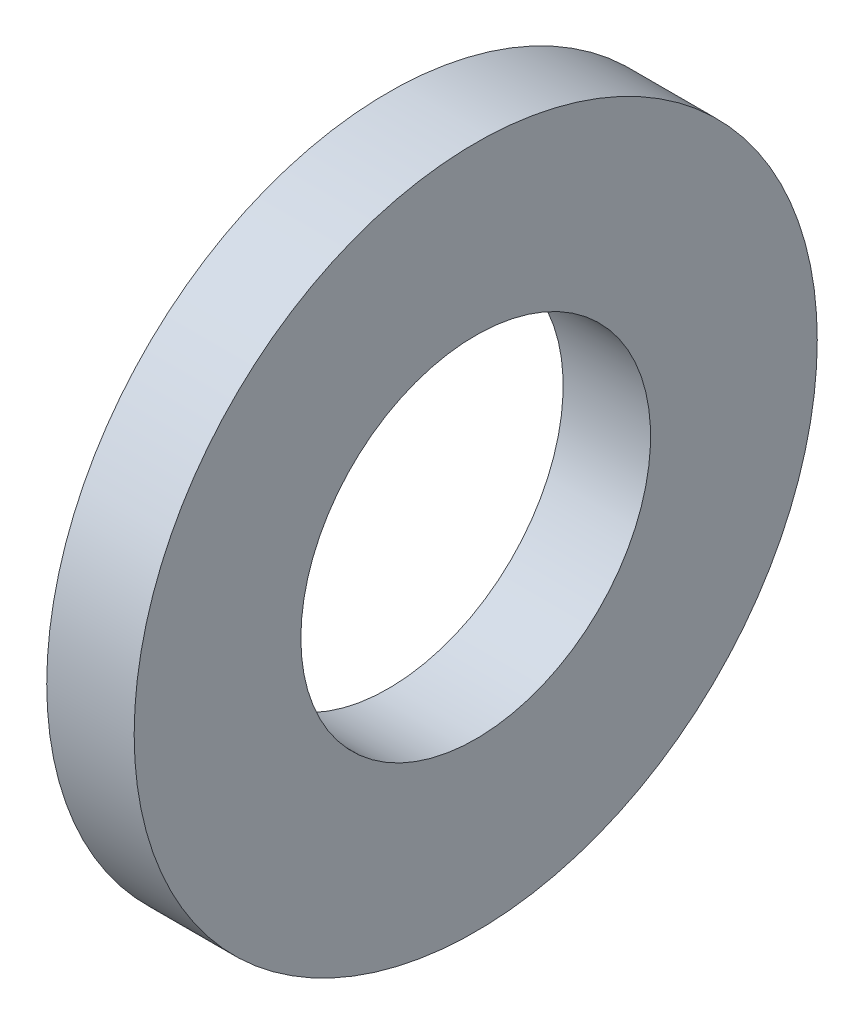
ISO-10303-21;
HEADER;
FILE_DESCRIPTION(('STEP AP214'),'2;1');
FILE_NAME('part.step','',(''),(''),'','','');
FILE_SCHEMA(('AUTOMOTIVE_DESIGN { 1 0 10303 214 1 1 1 1 }'));
ENDSEC;
DATA;
#1=APPLICATION_CONTEXT('core data for automotive mechanical design processes');
#2=APPLICATION_PROTOCOL_DEFINITION('international standard','automotive_design',2000,#1);
#3=PRODUCT_CONTEXT('',#1,'mechanical');
#4=PRODUCT('Part','Part','',(#3));
#5=PRODUCT_RELATED_PRODUCT_CATEGORY('part','',(#4));
#6=PRODUCT_DEFINITION_FORMATION('','',#4);
#7=PRODUCT_DEFINITION_CONTEXT('part definition',#1,'design');
#8=PRODUCT_DEFINITION('design','',#6,#7);
#9=PRODUCT_DEFINITION_SHAPE('','',#8);
#10=(LENGTH_UNIT() NAMED_UNIT(*) SI_UNIT(.MILLI.,.METRE.));
#11=(NAMED_UNIT(*) PLANE_ANGLE_UNIT() SI_UNIT($,.RADIAN.));
#12=(NAMED_UNIT(*) SI_UNIT($,.STERADIAN.) SOLID_ANGLE_UNIT());
#13=UNCERTAINTY_MEASURE_WITH_UNIT(LENGTH_MEASURE(1.E-05),#10,'distance_accuracy_value','');
#14=(GEOMETRIC_REPRESENTATION_CONTEXT(3) GLOBAL_UNCERTAINTY_ASSIGNED_CONTEXT((#13)) GLOBAL_UNIT_ASSIGNED_CONTEXT((#10,
#11,#12)) REPRESENTATION_CONTEXT('',''));
#15=CARTESIAN_POINT('',(0.,0.,0.));
#16=DIRECTION('',(0.,0.,1.));
#17=DIRECTION('',(1.,0.,0.));
#18=AXIS2_PLACEMENT_3D('',#15,#16,#17);
#19=CARTESIAN_POINT('',(-34.9249999999999,0.,0.));
#20=DIRECTION('',(-1.,0.,0.));
#21=DIRECTION('',(0.,0.,1.));
#22=AXIS2_PLACEMENT_3D('',#19,#20,#21);
#23=CYLINDRICAL_SURFACE('',#22,3.2);
#24=CARTESIAN_POINT('',(0.,0.,0.));
#25=DIRECTION('',(-1.,0.,0.));
#26=DIRECTION('',(0.,0.,1.));
#27=AXIS2_PLACEMENT_3D('',#24,#25,#26);
#28=CIRCLE('',#27,3.2);
#29=CARTESIAN_POINT('',(0.,0.,3.2));
#30=VERTEX_POINT('',#29);
#31=EDGE_CURVE('E10',#30,#30,#28,.T.);
#32=ORIENTED_EDGE('',*,*,#31,.F.);
#33=EDGE_LOOP('',(#32));
#34=FACE_BOUND('',#33,.T.);
#35=CARTESIAN_POINT('',(-1.6,0.,0.));
#36=DIRECTION('',(-1.,0.,0.));
#37=DIRECTION('',(0.,0.,1.));
#38=AXIS2_PLACEMENT_3D('',#35,#36,#37);
#39=CIRCLE('',#38,3.2);
#40=CARTESIAN_POINT('',(-1.6,0.,3.2));
#41=VERTEX_POINT('',#40);
#42=EDGE_CURVE('E45',#41,#41,#39,.T.);
#43=ORIENTED_EDGE('',*,*,#42,.T.);
#44=EDGE_LOOP('',(#43));
#45=FACE_BOUND('',#44,.T.);
#46=ADVANCED_FACE('F31',(#34,#45),#23,.F.);
#47=CARTESIAN_POINT('',(0.,3.2,0.));
#48=DIRECTION('',(-1.,0.,0.));
#49=DIRECTION('',(0.,0.,1.));
#50=AXIS2_PLACEMENT_3D('',#47,#48,#49);
#51=PLANE('',#50);
#52=CARTESIAN_POINT('',(0.,0.,0.));
#53=DIRECTION('',(-1.,0.,0.));
#54=DIRECTION('',(0.,0.,1.));
#55=AXIS2_PLACEMENT_3D('',#52,#53,#54);
#56=CIRCLE('',#55,6.25);
#57=CARTESIAN_POINT('',(0.,0.,6.25));
#58=VERTEX_POINT('',#57);
#59=EDGE_CURVE('E37',#58,#58,#56,.T.);
#60=ORIENTED_EDGE('',*,*,#59,.F.);
#61=EDGE_LOOP('',(#60));
#62=FACE_BOUND('',#61,.T.);
#63=ORIENTED_EDGE('',*,*,#31,.T.);
#64=EDGE_LOOP('',(#63));
#65=FACE_BOUND('',#64,.T.);
#66=ADVANCED_FACE('F60',(#62,#65),#51,.F.);
#67=CARTESIAN_POINT('',(-34.9249999999999,0.,0.));
#68=DIRECTION('',(-1.,0.,0.));
#69=DIRECTION('',(0.,0.,1.));
#70=AXIS2_PLACEMENT_3D('',#67,#68,#69);
#71=CYLINDRICAL_SURFACE('',#70,6.25);
#72=CARTESIAN_POINT('',(-1.6,0.,0.));
#73=DIRECTION('',(-1.,0.,0.));
#74=DIRECTION('',(0.,0.,1.));
#75=AXIS2_PLACEMENT_3D('',#72,#73,#74);
#76=CIRCLE('',#75,6.25);
#77=CARTESIAN_POINT('',(-1.6,0.,6.25));
#78=VERTEX_POINT('',#77);
#79=EDGE_CURVE('E41',#78,#78,#76,.T.);
#80=ORIENTED_EDGE('',*,*,#79,.F.);
#81=EDGE_LOOP('',(#80));
#82=FACE_BOUND('',#81,.T.);
#83=ORIENTED_EDGE('',*,*,#59,.T.);
#84=EDGE_LOOP('',(#83));
#85=FACE_BOUND('',#84,.T.);
#86=ADVANCED_FACE('F55',(#82,#85),#71,.T.);
#87=CARTESIAN_POINT('',(-1.6,6.25,0.));
#88=DIRECTION('',(1.,0.,0.));
#89=DIRECTION('',(0.,0.,-1.));
#90=AXIS2_PLACEMENT_3D('',#87,#88,#89);
#91=PLANE('',#90);
#92=ORIENTED_EDGE('',*,*,#42,.F.);
#93=EDGE_LOOP('',(#92));
#94=FACE_BOUND('',#93,.T.);
#95=ORIENTED_EDGE('',*,*,#79,.T.);
#96=EDGE_LOOP('',(#95));
#97=FACE_BOUND('',#96,.T.);
#98=ADVANCED_FACE('F52',(#94,#97),#91,.F.);
#99=CLOSED_SHELL('',(#46,#66,#86,#98));
#100=MANIFOLD_SOLID_BREP('B2',#99);
#101=ADVANCED_BREP_SHAPE_REPRESENTATION('',(#18,#100),#14);
#102=SHAPE_DEFINITION_REPRESENTATION(#9,#101);
ENDSEC;
END-ISO-10303-21;
